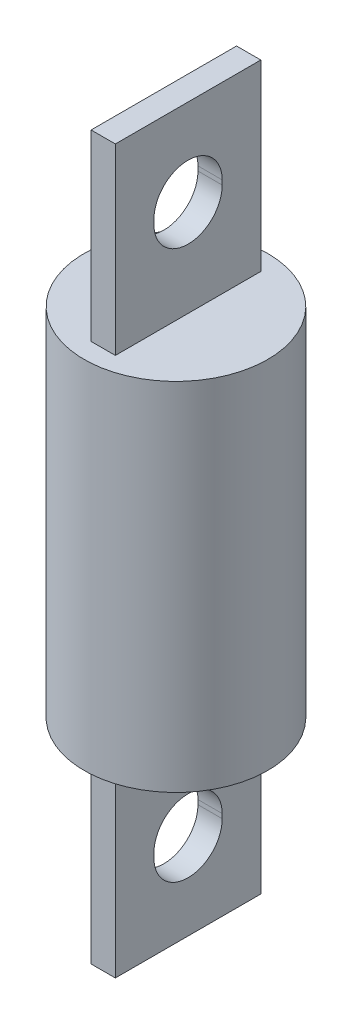
ISO-10303-21;
HEADER;
FILE_DESCRIPTION(('STEP AP214'),'2;1');
FILE_NAME('part.step','',(''),(''),'','','');
FILE_SCHEMA(('AUTOMOTIVE_DESIGN { 1 0 10303 214 1 1 1 1 }'));
ENDSEC;
DATA;
#1=APPLICATION_CONTEXT('core data for automotive mechanical design processes');
#2=APPLICATION_PROTOCOL_DEFINITION('international standard','automotive_design',2000,#1);
#3=PRODUCT_CONTEXT('',#1,'mechanical');
#4=PRODUCT('Part','Part','',(#3));
#5=PRODUCT_RELATED_PRODUCT_CATEGORY('part','',(#4));
#6=PRODUCT_DEFINITION_FORMATION('','',#4);
#7=PRODUCT_DEFINITION_CONTEXT('part definition',#1,'design');
#8=PRODUCT_DEFINITION('design','',#6,#7);
#9=PRODUCT_DEFINITION_SHAPE('','',#8);
#10=(LENGTH_UNIT() NAMED_UNIT(*) SI_UNIT(.MILLI.,.METRE.));
#11=(NAMED_UNIT(*) PLANE_ANGLE_UNIT() SI_UNIT($,.RADIAN.));
#12=(NAMED_UNIT(*) SI_UNIT($,.STERADIAN.) SOLID_ANGLE_UNIT());
#13=UNCERTAINTY_MEASURE_WITH_UNIT(LENGTH_MEASURE(1.E-05),#10,'distance_accuracy_value','');
#14=(GEOMETRIC_REPRESENTATION_CONTEXT(3) GLOBAL_UNCERTAINTY_ASSIGNED_CONTEXT((#13)) GLOBAL_UNIT_ASSIGNED_CONTEXT((#10,
#11,#12)) REPRESENTATION_CONTEXT('',''));
#15=CARTESIAN_POINT('',(0.,0.,0.));
#16=DIRECTION('',(0.,0.,1.));
#17=DIRECTION('',(1.,0.,0.));
#18=AXIS2_PLACEMENT_3D('',#15,#16,#17);
#19=CARTESIAN_POINT('',(-1.5875,-47.3075,-9.525));
#20=DIRECTION('',(-1.,0.,0.));
#21=DIRECTION('',(0.,0.,1.));
#22=AXIS2_PLACEMENT_3D('',#19,#20,#21);
#23=PLANE('',#22);
#24=DIRECTION('',(0.,0.,1.));
#25=VECTOR('',#24,1.);
#26=CARTESIAN_POINT('',(-1.5875,-23.3172,-9.525));
#27=LINE('',#26,#25);
#28=CARTESIAN_POINT('',(-1.5875,-23.3172,-9.525));
#29=VERTEX_POINT('',#28);
#30=CARTESIAN_POINT('',(-1.5875,-23.3172,9.52500000000001));
#31=VERTEX_POINT('',#30);
#32=EDGE_CURVE('E186',#29,#31,#27,.T.);
#33=ORIENTED_EDGE('',*,*,#32,.F.);
#34=DIRECTION('',(0.,1.,0.));
#35=VECTOR('',#34,1.);
#36=CARTESIAN_POINT('',(-1.5875,-47.3075,-9.525));
#37=LINE('',#36,#35);
#38=CARTESIAN_POINT('',(-1.5875,-47.3075,-9.525));
#39=VERTEX_POINT('',#38);
#40=EDGE_CURVE('E216',#39,#29,#37,.T.);
#41=ORIENTED_EDGE('',*,*,#40,.F.);
#42=DIRECTION('',(0.,0.,1.));
#43=VECTOR('',#42,1.);
#44=CARTESIAN_POINT('',(-1.5875,-47.3075,-9.525));
#45=LINE('',#44,#43);
#46=CARTESIAN_POINT('',(-1.5875,-47.3075,9.52500000000001));
#47=VERTEX_POINT('',#46);
#48=EDGE_CURVE('E187',#39,#47,#45,.T.);
#49=ORIENTED_EDGE('',*,*,#48,.T.);
#50=DIRECTION('',(0.,1.,0.));
#51=VECTOR('',#50,1.);
#52=CARTESIAN_POINT('',(-1.5875,-47.3075,9.52500000000001));
#53=LINE('',#52,#51);
#54=EDGE_CURVE('E200',#47,#31,#53,.T.);
#55=ORIENTED_EDGE('',*,*,#54,.T.);
#56=EDGE_LOOP('',(#33,#41,#49,#55));
#57=FACE_BOUND('',#56,.T.);
#58=DIRECTION('',(0.,-1.,0.));
#59=VECTOR('',#58,1.);
#60=CARTESIAN_POINT('',(-1.5875,-47.3075000000004,4.47039999999962));
#61=LINE('',#60,#59);
#62=CARTESIAN_POINT('',(-1.5875,-35.6489,4.47039999999999));
#63=VERTEX_POINT('',#62);
#64=CARTESIAN_POINT('',(-1.5875,-36.2331,4.47039999999997));
#65=VERTEX_POINT('',#64);
#66=EDGE_CURVE('E180',#63,#65,#61,.T.);
#67=ORIENTED_EDGE('',*,*,#66,.T.);
#68=CARTESIAN_POINT('',(-1.5875,-36.2331,0.));
#69=DIRECTION('',(-1.,0.,0.));
#70=DIRECTION('',(0.,0.,1.));
#71=AXIS2_PLACEMENT_3D('',#68,#69,#70);
#72=CIRCLE('',#71,4.47039999999997);
#73=CARTESIAN_POINT('',(-1.5875,-36.2331,-4.47039999999998));
#74=VERTEX_POINT('',#73);
#75=EDGE_CURVE('E183',#65,#74,#72,.F.);
#76=ORIENTED_EDGE('',*,*,#75,.T.);
#77=DIRECTION('',(0.,1.,0.));
#78=VECTOR('',#77,1.);
#79=CARTESIAN_POINT('',(-1.5875,-47.3074999999998,-4.47039999999964));
#80=LINE('',#79,#78);
#81=CARTESIAN_POINT('',(-1.5875,-35.6489,-4.4704));
#82=VERTEX_POINT('',#81);
#83=EDGE_CURVE('E175',#74,#82,#80,.T.);
#84=ORIENTED_EDGE('',*,*,#83,.T.);
#85=CARTESIAN_POINT('',(-1.5875,-35.6489,0.));
#86=DIRECTION('',(-1.,0.,0.));
#87=DIRECTION('',(0.,0.,1.));
#88=AXIS2_PLACEMENT_3D('',#85,#86,#87);
#89=CIRCLE('',#88,4.47039999999999);
#90=EDGE_CURVE('E156',#82,#63,#89,.F.);
#91=ORIENTED_EDGE('',*,*,#90,.T.);
#92=EDGE_LOOP('',(#67,#76,#84,#91));
#93=FACE_BOUND('',#92,.T.);
#94=ADVANCED_FACE('F37',(#57,#93),#23,.T.);
#95=CARTESIAN_POINT('',(1.5875,-47.3075,-9.525));
#96=DIRECTION('',(1.,0.,0.));
#97=DIRECTION('',(0.,0.,-1.));
#98=AXIS2_PLACEMENT_3D('',#95,#96,#97);
#99=PLANE('',#98);
#100=DIRECTION('',(0.,0.,-1.));
#101=VECTOR('',#100,1.);
#102=CARTESIAN_POINT('',(1.5875,-23.3172,-9.525));
#103=LINE('',#102,#101);
#104=CARTESIAN_POINT('',(1.5875,-23.3172,9.525));
#105=VERTEX_POINT('',#104);
#106=CARTESIAN_POINT('',(1.5875,-23.3172,-9.525));
#107=VERTEX_POINT('',#106);
#108=EDGE_CURVE('E206',#105,#107,#103,.T.);
#109=ORIENTED_EDGE('',*,*,#108,.F.);
#110=DIRECTION('',(0.,1.,0.));
#111=VECTOR('',#110,1.);
#112=CARTESIAN_POINT('',(1.5875,-47.3075,9.525));
#113=LINE('',#112,#111);
#114=CARTESIAN_POINT('',(1.5875,-47.3075,9.525));
#115=VERTEX_POINT('',#114);
#116=EDGE_CURVE('E212',#115,#105,#113,.T.);
#117=ORIENTED_EDGE('',*,*,#116,.F.);
#118=DIRECTION('',(0.,0.,-1.));
#119=VECTOR('',#118,1.);
#120=CARTESIAN_POINT('',(1.5875,-47.3075,-9.525));
#121=LINE('',#120,#119);
#122=CARTESIAN_POINT('',(1.5875,-47.3075,-9.525));
#123=VERTEX_POINT('',#122);
#124=EDGE_CURVE('E194',#115,#123,#121,.T.);
#125=ORIENTED_EDGE('',*,*,#124,.T.);
#126=DIRECTION('',(0.,1.,0.));
#127=VECTOR('',#126,1.);
#128=CARTESIAN_POINT('',(1.5875,-47.3075,-9.525));
#129=LINE('',#128,#127);
#130=EDGE_CURVE('E214',#123,#107,#129,.T.);
#131=ORIENTED_EDGE('',*,*,#130,.T.);
#132=EDGE_LOOP('',(#109,#117,#125,#131));
#133=FACE_BOUND('',#132,.T.);
#134=DIRECTION('',(0.,-1.,0.));
#135=VECTOR('',#134,1.);
#136=CARTESIAN_POINT('',(1.5875,-36.2331,-4.47039999999998));
#137=LINE('',#136,#135);
#138=CARTESIAN_POINT('',(1.5875,-35.6489,-4.4704));
#139=VERTEX_POINT('',#138);
#140=CARTESIAN_POINT('',(1.5875,-36.2331,-4.47039999999998));
#141=VERTEX_POINT('',#140);
#142=EDGE_CURVE('E162',#139,#141,#137,.T.);
#143=ORIENTED_EDGE('',*,*,#142,.T.);
#144=CARTESIAN_POINT('',(1.5875,-36.2331,0.));
#145=DIRECTION('',(-1.,0.,0.));
#146=DIRECTION('',(0.,0.,-1.));
#147=AXIS2_PLACEMENT_3D('',#144,#145,#146);
#148=CIRCLE('',#147,4.47039999999997);
#149=CARTESIAN_POINT('',(1.5875,-36.2331,4.47039999999997));
#150=VERTEX_POINT('',#149);
#151=EDGE_CURVE('E60',#141,#150,#148,.T.);
#152=ORIENTED_EDGE('',*,*,#151,.T.);
#153=DIRECTION('',(0.,1.,0.));
#154=VECTOR('',#153,1.);
#155=CARTESIAN_POINT('',(1.5875,-36.2331,4.47039999999997));
#156=LINE('',#155,#154);
#157=CARTESIAN_POINT('',(1.5875,-35.6489,4.47039999999999));
#158=VERTEX_POINT('',#157);
#159=EDGE_CURVE('E168',#150,#158,#156,.T.);
#160=ORIENTED_EDGE('',*,*,#159,.T.);
#161=CARTESIAN_POINT('',(1.5875,-35.6489,0.));
#162=DIRECTION('',(-1.,0.,0.));
#163=DIRECTION('',(0.,0.,-1.));
#164=AXIS2_PLACEMENT_3D('',#161,#162,#163);
#165=CIRCLE('',#164,4.47039999999999);
#166=EDGE_CURVE('E153',#158,#139,#165,.T.);
#167=ORIENTED_EDGE('',*,*,#166,.T.);
#168=EDGE_LOOP('',(#143,#152,#160,#167));
#169=FACE_BOUND('',#168,.T.);
#170=ADVANCED_FACE('F166',(#133,#169),#99,.T.);
#171=CARTESIAN_POINT('',(0.,23.3172,0.));
#172=DIRECTION('',(0.,-1.,0.));
#173=DIRECTION('',(0.,0.,-1.));
#174=AXIS2_PLACEMENT_3D('',#171,#172,#173);
#175=CYLINDRICAL_SURFACE('',#174,12.0269);
#176=CARTESIAN_POINT('',(0.,23.3172,0.));
#177=DIRECTION('',(0.,1.,0.));
#178=DIRECTION('',(0.,0.,1.));
#179=AXIS2_PLACEMENT_3D('',#176,#177,#178);
#180=CIRCLE('',#179,12.0269);
#181=CARTESIAN_POINT('',(0.,23.3172,-12.0269));
#182=VERTEX_POINT('',#181);
#183=EDGE_CURVE('E11',#182,#182,#180,.T.);
#184=CARTESIAN_POINT('',(0.,-23.3172,0.));
#185=DIRECTION('',(0.,1.,0.));
#186=DIRECTION('',(0.,0.,1.));
#187=AXIS2_PLACEMENT_3D('',#184,#185,#186);
#188=CIRCLE('',#187,12.0269);
#189=CARTESIAN_POINT('',(0.,-23.3172,-12.0269));
#190=VERTEX_POINT('',#189);
#191=EDGE_CURVE('E41',#190,#190,#188,.T.);
#192=CARTESIAN_POINT('',(0.,23.3172,-12.0269));
#193=CARTESIAN_POINT('',(0.,22.831425,-12.0269));
#194=CARTESIAN_POINT('',(0.,22.34565,-12.0269));
#195=CARTESIAN_POINT('',(0.,21.3741,-12.0269));
#196=CARTESIAN_POINT('',(0.,20.888325,-12.0269));
#197=CARTESIAN_POINT('',(0.,19.916775,-12.0269));
#198=CARTESIAN_POINT('',(0.,19.431,-12.0269));
#199=CARTESIAN_POINT('',(0.,18.45945,-12.0269));
#200=CARTESIAN_POINT('',(0.,17.973675,-12.0269));
#201=CARTESIAN_POINT('',(0.,17.002125,-12.0269));
#202=CARTESIAN_POINT('',(0.,16.51635,-12.0269));
#203=CARTESIAN_POINT('',(0.,15.5448,-12.0269));
#204=CARTESIAN_POINT('',(0.,15.059025,-12.0269));
#205=CARTESIAN_POINT('',(0.,14.087475,-12.0269));
#206=CARTESIAN_POINT('',(0.,13.6017,-12.0269));
#207=CARTESIAN_POINT('',(0.,12.63015,-12.0269));
#208=CARTESIAN_POINT('',(0.,12.144375,-12.0269));
#209=CARTESIAN_POINT('',(0.,11.172825,-12.0269));
#210=CARTESIAN_POINT('',(0.,10.68705,-12.0269));
#211=CARTESIAN_POINT('',(0.,9.7155,-12.0269));
#212=CARTESIAN_POINT('',(0.,9.229725,-12.0269));
#213=CARTESIAN_POINT('',(0.,8.258175,-12.0269));
#214=CARTESIAN_POINT('',(0.,7.7724,-12.0269));
#215=CARTESIAN_POINT('',(0.,6.80085,-12.0269));
#216=CARTESIAN_POINT('',(0.,6.315075,-12.0269));
#217=CARTESIAN_POINT('',(0.,5.343525,-12.0269));
#218=CARTESIAN_POINT('',(0.,4.85775,-12.0269));
#219=CARTESIAN_POINT('',(0.,3.8862,-12.0269));
#220=CARTESIAN_POINT('',(0.,3.400425,-12.0269));
#221=CARTESIAN_POINT('',(0.,2.428875,-12.0269));
#222=CARTESIAN_POINT('',(0.,1.9431,-12.0269));
#223=CARTESIAN_POINT('',(0.,0.971549999999996,-12.0269));
#224=CARTESIAN_POINT('',(0.,0.485774999999996,-12.0269));
#225=CARTESIAN_POINT('',(0.,-0.485775000000003,-12.0269));
#226=CARTESIAN_POINT('',(0.,-0.971550000000003,-12.0269));
#227=CARTESIAN_POINT('',(0.,-1.9431,-12.0269));
#228=CARTESIAN_POINT('',(0.,-2.428875,-12.0269));
#229=CARTESIAN_POINT('',(0.,-3.400425,-12.0269));
#230=CARTESIAN_POINT('',(0.,-3.8862,-12.0269));
#231=CARTESIAN_POINT('',(0.,-4.85775,-12.0269));
#232=CARTESIAN_POINT('',(0.,-5.343525,-12.0269));
#233=CARTESIAN_POINT('',(0.,-6.31507500000001,-12.0269));
#234=CARTESIAN_POINT('',(0.,-6.80085,-12.0269));
#235=CARTESIAN_POINT('',(0.,-7.7724,-12.0269));
#236=CARTESIAN_POINT('',(0.,-8.258175,-12.0269));
#237=CARTESIAN_POINT('',(0.,-9.229725,-12.0269));
#238=CARTESIAN_POINT('',(0.,-9.7155,-12.0269));
#239=CARTESIAN_POINT('',(0.,-10.68705,-12.0269));
#240=CARTESIAN_POINT('',(0.,-11.172825,-12.0269));
#241=CARTESIAN_POINT('',(0.,-12.144375,-12.0269));
#242=CARTESIAN_POINT('',(0.,-12.63015,-12.0269));
#243=CARTESIAN_POINT('',(0.,-13.6017,-12.0269));
#244=CARTESIAN_POINT('',(0.,-14.087475,-12.0269));
#245=CARTESIAN_POINT('',(0.,-15.059025,-12.0269));
#246=CARTESIAN_POINT('',(0.,-15.5448,-12.0269));
#247=CARTESIAN_POINT('',(0.,-16.51635,-12.0269));
#248=CARTESIAN_POINT('',(0.,-17.002125,-12.0269));
#249=CARTESIAN_POINT('',(0.,-17.973675,-12.0269));
#250=CARTESIAN_POINT('',(0.,-18.45945,-12.0269));
#251=CARTESIAN_POINT('',(0.,-19.431,-12.0269));
#252=CARTESIAN_POINT('',(0.,-19.916775,-12.0269));
#253=CARTESIAN_POINT('',(0.,-20.888325,-12.0269));
#254=CARTESIAN_POINT('',(0.,-21.3741,-12.0269));
#255=CARTESIAN_POINT('',(0.,-22.34565,-12.0269));
#256=CARTESIAN_POINT('',(0.,-22.831425,-12.0269));
#257=CARTESIAN_POINT('',(0.,-23.3172,-12.0269));
#258=B_SPLINE_CURVE_WITH_KNOTS('',3,(#192,#193,#194,#195,#196,#197,#198,#199,#200,#201,#202,
#203,#204,#205,#206,#207,#208,#209,#210,#211,#212,#213,#214,#215,#216,#217,#218,#219,#220,#221,
#222,#223,#224,#225,#226,#227,#228,#229,#230,#231,#232,#233,#234,#235,#236,#237,#238,#239,#240,
#241,#242,#243,#244,#245,#246,#247,#248,#249,#250,#251,#252,#253,#254,#255,#256,#257),
.UNSPECIFIED.,.F.,.F.,(4,2,2,2,2,2,2,2,2,2,2,2,2,2,2,2,2,2,2,2,2,2,2,2,2,2,2,2,2,2,2,2,4),(0.,
1.457325,2.91465,4.371975,5.8293,7.286625,8.74395,10.201275,11.6586,13.115925,14.57325,
16.030575,17.4879,18.945225,20.40255,21.859875,23.3172,24.774525,26.23185,27.689175,29.1465,
30.603825,32.06115,33.518475,34.9758,36.433125,37.89045,39.347775,40.8051,42.262425,43.71975,
45.177075,46.6344),.UNSPECIFIED.);
#259=EDGE_CURVE('BSEAM39',#182,#190,#258,.T.);
#260=ORIENTED_EDGE('',*,*,#183,.F.);
#261=ORIENTED_EDGE('',*,*,#191,.T.);
#262=ORIENTED_EDGE('',*,*,#259,.T.);
#263=ORIENTED_EDGE('',*,*,#259,.F.);
#264=EDGE_LOOP('',(#260,#262,#261,#263));
#265=FACE_BOUND('',#264,.T.);
#266=ADVANCED_FACE('F39',(#265),#175,.T.);
#267=CARTESIAN_POINT('',(0.,23.3172,0.));
#268=DIRECTION('',(0.,1.,0.));
#269=DIRECTION('',(0.,0.,1.));
#270=AXIS2_PLACEMENT_3D('',#267,#268,#269);
#271=PLANE('',#270);
#272=DIRECTION('',(0.,0.,1.));
#273=VECTOR('',#272,1.);
#274=CARTESIAN_POINT('',(-1.5875,23.3172,-9.525));
#275=LINE('',#274,#273);
#276=CARTESIAN_POINT('',(-1.5875,23.3172,-9.525));
#277=VERTEX_POINT('',#276);
#278=CARTESIAN_POINT('',(-1.5875,23.3172,9.52500000000001));
#279=VERTEX_POINT('',#278);
#280=EDGE_CURVE('E251',#277,#279,#275,.T.);
#281=ORIENTED_EDGE('',*,*,#280,.F.);
#282=DIRECTION('',(-1.,0.,0.));
#283=VECTOR('',#282,1.);
#284=CARTESIAN_POINT('',(1.5875,23.3172,-9.525));
#285=LINE('',#284,#283);
#286=CARTESIAN_POINT('',(1.5875,23.3172,-9.525));
#287=VERTEX_POINT('',#286);
#288=EDGE_CURVE('E256',#287,#277,#285,.T.);
#289=ORIENTED_EDGE('',*,*,#288,.F.);
#290=DIRECTION('',(0.,0.,-1.));
#291=VECTOR('',#290,1.);
#292=CARTESIAN_POINT('',(1.5875,23.3172,-9.525));
#293=LINE('',#292,#291);
#294=CARTESIAN_POINT('',(1.5875,23.3172,9.525));
#295=VERTEX_POINT('',#294);
#296=EDGE_CURVE('E268',#295,#287,#293,.T.);
#297=ORIENTED_EDGE('',*,*,#296,.F.);
#298=DIRECTION('',(1.,0.,0.));
#299=VECTOR('',#298,1.);
#300=CARTESIAN_POINT('',(1.5875,23.3172,9.525));
#301=LINE('',#300,#299);
#302=EDGE_CURVE('E265',#279,#295,#301,.T.);
#303=ORIENTED_EDGE('',*,*,#302,.F.);
#304=EDGE_LOOP('',(#281,#289,#297,#303));
#305=FACE_BOUND('',#304,.T.);
#306=ORIENTED_EDGE('',*,*,#183,.T.);
#307=EDGE_LOOP('',(#306));
#308=FACE_BOUND('',#307,.T.);
#309=ADVANCED_FACE('F292',(#305,#308),#271,.T.);
#310=CARTESIAN_POINT('',(0.,-23.3172,0.));
#311=DIRECTION('',(0.,1.,0.));
#312=DIRECTION('',(0.,0.,1.));
#313=AXIS2_PLACEMENT_3D('',#310,#311,#312);
#314=PLANE('',#313);
#315=DIRECTION('',(-1.,0.,0.));
#316=VECTOR('',#315,1.);
#317=CARTESIAN_POINT('',(1.5875,-23.3172,-9.525));
#318=LINE('',#317,#316);
#319=EDGE_CURVE('E203',#107,#29,#318,.T.);
#320=ORIENTED_EDGE('',*,*,#319,.T.);
#321=ORIENTED_EDGE('',*,*,#32,.T.);
#322=DIRECTION('',(1.,0.,0.));
#323=VECTOR('',#322,1.);
#324=CARTESIAN_POINT('',(1.5875,-23.3172,9.525));
#325=LINE('',#324,#323);
#326=EDGE_CURVE('E191',#31,#105,#325,.T.);
#327=ORIENTED_EDGE('',*,*,#326,.T.);
#328=ORIENTED_EDGE('',*,*,#108,.T.);
#329=EDGE_LOOP('',(#320,#321,#327,#328));
#330=FACE_BOUND('',#329,.T.);
#331=ORIENTED_EDGE('',*,*,#191,.F.);
#332=EDGE_LOOP('',(#331));
#333=FACE_BOUND('',#332,.T.);
#334=ADVANCED_FACE('F289',(#330,#333),#314,.F.);
#335=CARTESIAN_POINT('',(-1.5875,47.3075,-9.525));
#336=DIRECTION('',(1.,0.,0.));
#337=DIRECTION('',(0.,0.,-1.));
#338=AXIS2_PLACEMENT_3D('',#335,#336,#337);
#339=PLANE('',#338);
#340=DIRECTION('',(0.,1.,0.));
#341=VECTOR('',#340,1.);
#342=CARTESIAN_POINT('',(-1.5875,47.3074999999998,-4.47039999999964));
#343=LINE('',#342,#341);
#344=CARTESIAN_POINT('',(-1.5875,35.6489,-4.4704));
#345=VERTEX_POINT('',#344);
#346=CARTESIAN_POINT('',(-1.5875,36.2331,-4.47039999999998));
#347=VERTEX_POINT('',#346);
#348=EDGE_CURVE('E245',#345,#347,#343,.T.);
#349=ORIENTED_EDGE('',*,*,#348,.T.);
#350=CARTESIAN_POINT('',(-1.5875,36.2331,0.));
#351=DIRECTION('',(1.,0.,0.));
#352=DIRECTION('',(0.,0.,-1.));
#353=AXIS2_PLACEMENT_3D('',#350,#351,#352);
#354=CIRCLE('',#353,4.47039999999997);
#355=CARTESIAN_POINT('',(-1.5875,36.2331,4.47039999999997));
#356=VERTEX_POINT('',#355);
#357=EDGE_CURVE('E248',#347,#356,#354,.T.);
#358=ORIENTED_EDGE('',*,*,#357,.T.);
#359=DIRECTION('',(0.,-1.,0.));
#360=VECTOR('',#359,1.);
#361=CARTESIAN_POINT('',(-1.5875,47.3075000000004,4.47039999999962));
#362=LINE('',#361,#360);
#363=CARTESIAN_POINT('',(-1.5875,35.6489,4.47039999999998));
#364=VERTEX_POINT('',#363);
#365=EDGE_CURVE('E233',#356,#364,#362,.T.);
#366=ORIENTED_EDGE('',*,*,#365,.T.);
#367=CARTESIAN_POINT('',(-1.5875,35.6489,0.));
#368=DIRECTION('',(1.,0.,0.));
#369=DIRECTION('',(0.,0.,-1.));
#370=AXIS2_PLACEMENT_3D('',#367,#368,#369);
#371=CIRCLE('',#370,4.47039999999999);
#372=EDGE_CURVE('E242',#364,#345,#371,.T.);
#373=ORIENTED_EDGE('',*,*,#372,.T.);
#374=EDGE_LOOP('',(#349,#358,#366,#373));
#375=FACE_BOUND('',#374,.T.);
#376=ORIENTED_EDGE('',*,*,#280,.T.);
#377=DIRECTION('',(0.,-1.,0.));
#378=VECTOR('',#377,1.);
#379=CARTESIAN_POINT('',(-1.5875,47.3075,9.52500000000001));
#380=LINE('',#379,#378);
#381=CARTESIAN_POINT('',(-1.5875,47.3075,9.52500000000001));
#382=VERTEX_POINT('',#381);
#383=EDGE_CURVE('E281',#382,#279,#380,.T.);
#384=ORIENTED_EDGE('',*,*,#383,.F.);
#385=DIRECTION('',(0.,0.,1.));
#386=VECTOR('',#385,1.);
#387=CARTESIAN_POINT('',(-1.5875,47.3075,-9.525));
#388=LINE('',#387,#386);
#389=CARTESIAN_POINT('',(-1.5875,47.3075,-9.525));
#390=VERTEX_POINT('',#389);
#391=EDGE_CURVE('E252',#390,#382,#388,.T.);
#392=ORIENTED_EDGE('',*,*,#391,.F.);
#393=DIRECTION('',(0.,-1.,0.));
#394=VECTOR('',#393,1.);
#395=CARTESIAN_POINT('',(-1.5875,47.3075,-9.525));
#396=LINE('',#395,#394);
#397=EDGE_CURVE('E262',#390,#277,#396,.T.);
#398=ORIENTED_EDGE('',*,*,#397,.T.);
#399=EDGE_LOOP('',(#376,#384,#392,#398));
#400=FACE_BOUND('',#399,.T.);
#401=ADVANCED_FACE('F291',(#375,#400),#339,.F.);
#402=CARTESIAN_POINT('',(1.5875,47.3075,9.525));
#403=DIRECTION('',(0.,0.,-1.));
#404=DIRECTION('',(-1.,0.,0.));
#405=AXIS2_PLACEMENT_3D('',#402,#403,#404);
#406=PLANE('',#405);
#407=ORIENTED_EDGE('',*,*,#302,.T.);
#408=DIRECTION('',(0.,-1.,0.));
#409=VECTOR('',#408,1.);
#410=CARTESIAN_POINT('',(1.5875,47.3075,9.525));
#411=LINE('',#410,#409);
#412=CARTESIAN_POINT('',(1.5875,47.3075,9.525));
#413=VERTEX_POINT('',#412);
#414=EDGE_CURVE('E278',#413,#295,#411,.T.);
#415=ORIENTED_EDGE('',*,*,#414,.F.);
#416=DIRECTION('',(1.,0.,0.));
#417=VECTOR('',#416,1.);
#418=CARTESIAN_POINT('',(1.5875,47.3075,9.525));
#419=LINE('',#418,#417);
#420=EDGE_CURVE('E255',#382,#413,#419,.T.);
#421=ORIENTED_EDGE('',*,*,#420,.F.);
#422=ORIENTED_EDGE('',*,*,#383,.T.);
#423=EDGE_LOOP('',(#407,#415,#421,#422));
#424=FACE_BOUND('',#423,.T.);
#425=ADVANCED_FACE('F298',(#424),#406,.F.);
#426=CARTESIAN_POINT('',(1.5875,47.3075,-9.525));
#427=DIRECTION('',(-1.,0.,0.));
#428=DIRECTION('',(0.,0.,1.));
#429=AXIS2_PLACEMENT_3D('',#426,#427,#428);
#430=PLANE('',#429);
#431=DIRECTION('',(0.,-1.,0.));
#432=VECTOR('',#431,1.);
#433=CARTESIAN_POINT('',(1.5875,36.2331,4.47039999999997));
#434=LINE('',#433,#432);
#435=CARTESIAN_POINT('',(1.5875,36.2331,4.47039999999997));
#436=VERTEX_POINT('',#435);
#437=CARTESIAN_POINT('',(1.5875,35.6489,4.47039999999999));
#438=VERTEX_POINT('',#437);
#439=EDGE_CURVE('E221',#436,#438,#434,.T.);
#440=ORIENTED_EDGE('',*,*,#439,.F.);
#441=CARTESIAN_POINT('',(1.5875,36.2331,0.));
#442=DIRECTION('',(1.,0.,0.));
#443=DIRECTION('',(0.,0.,-1.));
#444=AXIS2_PLACEMENT_3D('',#441,#442,#443);
#445=CIRCLE('',#444,4.47039999999997);
#446=CARTESIAN_POINT('',(1.5875,36.2331,-4.47039999999998));
#447=VERTEX_POINT('',#446);
#448=EDGE_CURVE('E219',#447,#436,#445,.T.);
#449=ORIENTED_EDGE('',*,*,#448,.F.);
#450=DIRECTION('',(0.,1.,0.));
#451=VECTOR('',#450,1.);
#452=CARTESIAN_POINT('',(1.5875,36.2331,-4.47039999999998));
#453=LINE('',#452,#451);
#454=CARTESIAN_POINT('',(1.5875,35.6489,-4.4704));
#455=VERTEX_POINT('',#454);
#456=EDGE_CURVE('E227',#455,#447,#453,.T.);
#457=ORIENTED_EDGE('',*,*,#456,.F.);
#458=CARTESIAN_POINT('',(1.5875,35.6489,0.));
#459=DIRECTION('',(1.,0.,0.));
#460=DIRECTION('',(0.,0.,-1.));
#461=AXIS2_PLACEMENT_3D('',#458,#459,#460);
#462=CIRCLE('',#461,4.47039999999999);
#463=EDGE_CURVE('E224',#438,#455,#462,.T.);
#464=ORIENTED_EDGE('',*,*,#463,.F.);
#465=EDGE_LOOP('',(#440,#449,#457,#464));
#466=FACE_BOUND('',#465,.T.);
#467=ORIENTED_EDGE('',*,*,#296,.T.);
#468=DIRECTION('',(0.,-1.,0.));
#469=VECTOR('',#468,1.);
#470=CARTESIAN_POINT('',(1.5875,47.3075,-9.525));
#471=LINE('',#470,#469);
#472=CARTESIAN_POINT('',(1.5875,47.3075,-9.525));
#473=VERTEX_POINT('',#472);
#474=EDGE_CURVE('E275',#473,#287,#471,.T.);
#475=ORIENTED_EDGE('',*,*,#474,.F.);
#476=DIRECTION('',(0.,0.,-1.));
#477=VECTOR('',#476,1.);
#478=CARTESIAN_POINT('',(1.5875,47.3075,-9.525));
#479=LINE('',#478,#477);
#480=EDGE_CURVE('E258',#413,#473,#479,.T.);
#481=ORIENTED_EDGE('',*,*,#480,.F.);
#482=ORIENTED_EDGE('',*,*,#414,.T.);
#483=EDGE_LOOP('',(#467,#475,#481,#482));
#484=FACE_BOUND('',#483,.T.);
#485=ADVANCED_FACE('F338',(#466,#484),#430,.F.);
#486=CARTESIAN_POINT('',(1.5875,47.3075,-9.525));
#487=DIRECTION('',(0.,0.,1.));
#488=DIRECTION('',(1.,0.,0.));
#489=AXIS2_PLACEMENT_3D('',#486,#487,#488);
#490=PLANE('',#489);
#491=ORIENTED_EDGE('',*,*,#288,.T.);
#492=ORIENTED_EDGE('',*,*,#397,.F.);
#493=DIRECTION('',(-1.,0.,0.));
#494=VECTOR('',#493,1.);
#495=CARTESIAN_POINT('',(1.5875,47.3075,-9.525));
#496=LINE('',#495,#494);
#497=EDGE_CURVE('E260',#473,#390,#496,.T.);
#498=ORIENTED_EDGE('',*,*,#497,.F.);
#499=ORIENTED_EDGE('',*,*,#474,.T.);
#500=EDGE_LOOP('',(#491,#492,#498,#499));
#501=FACE_BOUND('',#500,.T.);
#502=ADVANCED_FACE('F334',(#501),#490,.F.);
#503=CARTESIAN_POINT('',(0.,47.3075,0.));
#504=DIRECTION('',(0.,-1.,0.));
#505=DIRECTION('',(0.,0.,-1.));
#506=AXIS2_PLACEMENT_3D('',#503,#504,#505);
#507=PLANE('',#506);
#508=ORIENTED_EDGE('',*,*,#391,.T.);
#509=ORIENTED_EDGE('',*,*,#420,.T.);
#510=ORIENTED_EDGE('',*,*,#480,.T.);
#511=ORIENTED_EDGE('',*,*,#497,.T.);
#512=EDGE_LOOP('',(#508,#509,#510,#511));
#513=FACE_BOUND('',#512,.T.);
#514=ADVANCED_FACE('F330',(#513),#507,.F.);
#515=CARTESIAN_POINT('',(-8.4125,36.2331,0.));
#516=DIRECTION('',(1.,0.,0.));
#517=DIRECTION('',(0.,0.,-1.));
#518=AXIS2_PLACEMENT_3D('',#515,#516,#517);
#519=CYLINDRICAL_SURFACE('',#518,4.47039999999997);
#520=DIRECTION('',(1.,0.,0.));
#521=VECTOR('',#520,1.);
#522=CARTESIAN_POINT('',(-8.4125,36.2331,-4.47039999999998));
#523=LINE('',#522,#521);
#524=EDGE_CURVE('E231',#347,#447,#523,.T.);
#525=ORIENTED_EDGE('',*,*,#524,.T.);
#526=ORIENTED_EDGE('',*,*,#448,.T.);
#527=DIRECTION('',(1.,0.,0.));
#528=VECTOR('',#527,1.);
#529=CARTESIAN_POINT('',(-8.4125,36.2331,4.47039999999997));
#530=LINE('',#529,#528);
#531=EDGE_CURVE('E230',#356,#436,#530,.T.);
#532=ORIENTED_EDGE('',*,*,#531,.F.);
#533=ORIENTED_EDGE('',*,*,#357,.F.);
#534=EDGE_LOOP('',(#525,#526,#532,#533));
#535=FACE_BOUND('',#534,.T.);
#536=ADVANCED_FACE('F319',(#535),#519,.F.);
#537=CARTESIAN_POINT('',(-8.4125,36.2331,-4.47039999999998));
#538=DIRECTION('',(0.,0.,-1.));
#539=DIRECTION('',(0.,1.,0.));
#540=AXIS2_PLACEMENT_3D('',#537,#538,#539);
#541=PLANE('',#540);
#542=DIRECTION('',(1.,0.,0.));
#543=VECTOR('',#542,1.);
#544=CARTESIAN_POINT('',(-8.4125,35.6489,-4.4704));
#545=LINE('',#544,#543);
#546=EDGE_CURVE('E234',#345,#455,#545,.T.);
#547=ORIENTED_EDGE('',*,*,#546,.T.);
#548=ORIENTED_EDGE('',*,*,#456,.T.);
#549=ORIENTED_EDGE('',*,*,#524,.F.);
#550=ORIENTED_EDGE('',*,*,#348,.F.);
#551=EDGE_LOOP('',(#547,#548,#549,#550));
#552=FACE_BOUND('',#551,.T.);
#553=ADVANCED_FACE('F315',(#552),#541,.F.);
#554=CARTESIAN_POINT('',(-8.4125,35.6489,0.));
#555=DIRECTION('',(1.,0.,0.));
#556=DIRECTION('',(0.,0.,-1.));
#557=AXIS2_PLACEMENT_3D('',#554,#555,#556);
#558=CYLINDRICAL_SURFACE('',#557,4.47039999999999);
#559=DIRECTION('',(1.,0.,0.));
#560=VECTOR('',#559,1.);
#561=CARTESIAN_POINT('',(-8.4125,35.6489,4.47039999999999));
#562=LINE('',#561,#560);
#563=EDGE_CURVE('E236',#364,#438,#562,.T.);
#564=ORIENTED_EDGE('',*,*,#563,.T.);
#565=ORIENTED_EDGE('',*,*,#463,.T.);
#566=ORIENTED_EDGE('',*,*,#546,.F.);
#567=ORIENTED_EDGE('',*,*,#372,.F.);
#568=EDGE_LOOP('',(#564,#565,#566,#567));
#569=FACE_BOUND('',#568,.T.);
#570=ADVANCED_FACE('F318',(#569),#558,.F.);
#571=CARTESIAN_POINT('',(-8.4125,36.2331,4.47039999999997));
#572=DIRECTION('',(0.,0.,1.));
#573=DIRECTION('',(0.,-1.,0.));
#574=AXIS2_PLACEMENT_3D('',#571,#572,#573);
#575=PLANE('',#574);
#576=ORIENTED_EDGE('',*,*,#531,.T.);
#577=ORIENTED_EDGE('',*,*,#439,.T.);
#578=ORIENTED_EDGE('',*,*,#563,.F.);
#579=ORIENTED_EDGE('',*,*,#365,.F.);
#580=EDGE_LOOP('',(#576,#577,#578,#579));
#581=FACE_BOUND('',#580,.T.);
#582=ADVANCED_FACE('F323',(#581),#575,.F.);
#583=CARTESIAN_POINT('',(1.5875,-47.3075,-9.525));
#584=DIRECTION('',(0.,0.,-1.));
#585=DIRECTION('',(-1.,0.,0.));
#586=AXIS2_PLACEMENT_3D('',#583,#584,#585);
#587=PLANE('',#586);
#588=ORIENTED_EDGE('',*,*,#319,.F.);
#589=ORIENTED_EDGE('',*,*,#130,.F.);
#590=DIRECTION('',(-1.,0.,0.));
#591=VECTOR('',#590,1.);
#592=CARTESIAN_POINT('',(1.5875,-47.3075,-9.525));
#593=LINE('',#592,#591);
#594=EDGE_CURVE('E190',#123,#39,#593,.T.);
#595=ORIENTED_EDGE('',*,*,#594,.T.);
#596=ORIENTED_EDGE('',*,*,#40,.T.);
#597=EDGE_LOOP('',(#588,#589,#595,#596));
#598=FACE_BOUND('',#597,.T.);
#599=ADVANCED_FACE('F314',(#598),#587,.T.);
#600=CARTESIAN_POINT('',(1.5875,-47.3075,9.525));
#601=DIRECTION('',(0.,0.,1.));
#602=DIRECTION('',(1.,0.,0.));
#603=AXIS2_PLACEMENT_3D('',#600,#601,#602);
#604=PLANE('',#603);
#605=ORIENTED_EDGE('',*,*,#326,.F.);
#606=ORIENTED_EDGE('',*,*,#54,.F.);
#607=DIRECTION('',(1.,0.,0.));
#608=VECTOR('',#607,1.);
#609=CARTESIAN_POINT('',(1.5875,-47.3075,9.525));
#610=LINE('',#609,#608);
#611=EDGE_CURVE('E197',#47,#115,#610,.T.);
#612=ORIENTED_EDGE('',*,*,#611,.T.);
#613=ORIENTED_EDGE('',*,*,#116,.T.);
#614=EDGE_LOOP('',(#605,#606,#612,#613));
#615=FACE_BOUND('',#614,.T.);
#616=ADVANCED_FACE('F459',(#615),#604,.T.);
#617=CARTESIAN_POINT('',(0.,-47.3075,0.));
#618=DIRECTION('',(0.,1.,0.));
#619=DIRECTION('',(0.,0.,-1.));
#620=AXIS2_PLACEMENT_3D('',#617,#618,#619);
#621=PLANE('',#620);
#622=ORIENTED_EDGE('',*,*,#48,.F.);
#623=ORIENTED_EDGE('',*,*,#594,.F.);
#624=ORIENTED_EDGE('',*,*,#124,.F.);
#625=ORIENTED_EDGE('',*,*,#611,.F.);
#626=EDGE_LOOP('',(#622,#623,#624,#625));
#627=FACE_BOUND('',#626,.T.);
#628=ADVANCED_FACE('F469',(#627),#621,.F.);
#629=CARTESIAN_POINT('',(-8.4125,-36.2331,0.));
#630=DIRECTION('',(1.,0.,0.));
#631=DIRECTION('',(0.,0.,-1.));
#632=AXIS2_PLACEMENT_3D('',#629,#630,#631);
#633=CYLINDRICAL_SURFACE('',#632,4.47039999999997);
#634=DIRECTION('',(1.,0.,0.));
#635=VECTOR('',#634,1.);
#636=CARTESIAN_POINT('',(-8.4125,-36.2331,4.47039999999997));
#637=LINE('',#636,#635);
#638=EDGE_CURVE('E173',#65,#150,#637,.T.);
#639=ORIENTED_EDGE('',*,*,#638,.T.);
#640=ORIENTED_EDGE('',*,*,#151,.F.);
#641=DIRECTION('',(1.,0.,0.));
#642=VECTOR('',#641,1.);
#643=CARTESIAN_POINT('',(-8.4125,-36.2331,-4.47039999999998));
#644=LINE('',#643,#642);
#645=EDGE_CURVE('E159',#74,#141,#644,.T.);
#646=ORIENTED_EDGE('',*,*,#645,.F.);
#647=ORIENTED_EDGE('',*,*,#75,.F.);
#648=EDGE_LOOP('',(#639,#640,#646,#647));
#649=FACE_BOUND('',#648,.T.);
#650=ADVANCED_FACE('F478',(#649),#633,.F.);
#651=CARTESIAN_POINT('',(-8.4125,-36.2331,4.47039999999997));
#652=DIRECTION('',(0.,0.,-1.));
#653=DIRECTION('',(0.,1.,0.));
#654=AXIS2_PLACEMENT_3D('',#651,#652,#653);
#655=PLANE('',#654);
#656=DIRECTION('',(1.,0.,0.));
#657=VECTOR('',#656,1.);
#658=CARTESIAN_POINT('',(-8.4125,-35.6489,4.47039999999999));
#659=LINE('',#658,#657);
#660=EDGE_CURVE('E158',#63,#158,#659,.T.);
#661=ORIENTED_EDGE('',*,*,#660,.T.);
#662=ORIENTED_EDGE('',*,*,#159,.F.);
#663=ORIENTED_EDGE('',*,*,#638,.F.);
#664=ORIENTED_EDGE('',*,*,#66,.F.);
#665=EDGE_LOOP('',(#661,#662,#663,#664));
#666=FACE_BOUND('',#665,.T.);
#667=ADVANCED_FACE('F488',(#666),#655,.T.);
#668=CARTESIAN_POINT('',(-8.4125,-35.6489,0.));
#669=DIRECTION('',(1.,0.,0.));
#670=DIRECTION('',(0.,0.,-1.));
#671=AXIS2_PLACEMENT_3D('',#668,#669,#670);
#672=CYLINDRICAL_SURFACE('',#671,4.47039999999999);
#673=DIRECTION('',(1.,0.,0.));
#674=VECTOR('',#673,1.);
#675=CARTESIAN_POINT('',(-8.4125,-35.6489,-4.4704));
#676=LINE('',#675,#674);
#677=EDGE_CURVE('E52',#82,#139,#676,.T.);
#678=ORIENTED_EDGE('',*,*,#677,.T.);
#679=ORIENTED_EDGE('',*,*,#166,.F.);
#680=ORIENTED_EDGE('',*,*,#660,.F.);
#681=ORIENTED_EDGE('',*,*,#90,.F.);
#682=EDGE_LOOP('',(#678,#679,#680,#681));
#683=FACE_BOUND('',#682,.T.);
#684=ADVANCED_FACE('F150',(#683),#672,.F.);
#685=CARTESIAN_POINT('',(-8.4125,-36.2331,-4.47039999999998));
#686=DIRECTION('',(0.,0.,1.));
#687=DIRECTION('',(0.,-1.,0.));
#688=AXIS2_PLACEMENT_3D('',#685,#686,#687);
#689=PLANE('',#688);
#690=ORIENTED_EDGE('',*,*,#645,.T.);
#691=ORIENTED_EDGE('',*,*,#142,.F.);
#692=ORIENTED_EDGE('',*,*,#677,.F.);
#693=ORIENTED_EDGE('',*,*,#83,.F.);
#694=EDGE_LOOP('',(#690,#691,#692,#693));
#695=FACE_BOUND('',#694,.T.);
#696=ADVANCED_FACE('F163',(#695),#689,.T.);
#697=CLOSED_SHELL('',(#94,#170,#266,#309,#334,#401,#425,#485,#502,#514,#536,#553,#570,#582,#599,
#616,#628,#650,#667,#684,#696));
#698=MANIFOLD_SOLID_BREP('B2',#697);
#699=ADVANCED_BREP_SHAPE_REPRESENTATION('',(#18,#698),#14);
#700=SHAPE_DEFINITION_REPRESENTATION(#9,#699);
ENDSEC;
END-ISO-10303-21;
